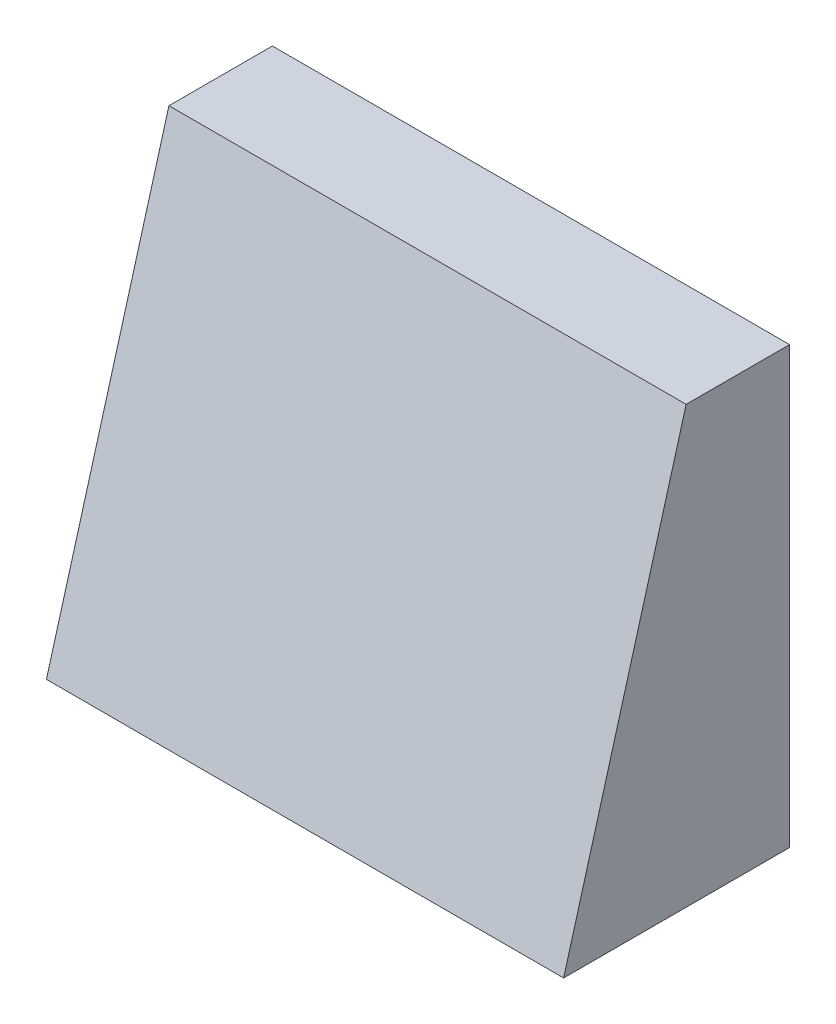
ISO-10303-21;
HEADER;
FILE_DESCRIPTION(('STEP AP214'),'2;1');
FILE_NAME('part.step','',(''),(''),'','','');
FILE_SCHEMA(('AUTOMOTIVE_DESIGN { 1 0 10303 214 1 1 1 1 }'));
ENDSEC;
DATA;
#1=APPLICATION_CONTEXT('core data for automotive mechanical design processes');
#2=APPLICATION_PROTOCOL_DEFINITION('international standard','automotive_design',2000,#1);
#3=PRODUCT_CONTEXT('',#1,'mechanical');
#4=PRODUCT('Part','Part','',(#3));
#5=PRODUCT_RELATED_PRODUCT_CATEGORY('part','',(#4));
#6=PRODUCT_DEFINITION_FORMATION('','',#4);
#7=PRODUCT_DEFINITION_CONTEXT('part definition',#1,'design');
#8=PRODUCT_DEFINITION('design','',#6,#7);
#9=PRODUCT_DEFINITION_SHAPE('','',#8);
#10=(LENGTH_UNIT() NAMED_UNIT(*) SI_UNIT(.MILLI.,.METRE.));
#11=(NAMED_UNIT(*) PLANE_ANGLE_UNIT() SI_UNIT($,.RADIAN.));
#12=(NAMED_UNIT(*) SI_UNIT($,.STERADIAN.) SOLID_ANGLE_UNIT());
#13=UNCERTAINTY_MEASURE_WITH_UNIT(LENGTH_MEASURE(1.E-05),#10,'distance_accuracy_value','');
#14=(GEOMETRIC_REPRESENTATION_CONTEXT(3) GLOBAL_UNCERTAINTY_ASSIGNED_CONTEXT((#13)) GLOBAL_UNIT_ASSIGNED_CONTEXT((#10,
#11,#12)) REPRESENTATION_CONTEXT('',''));
#15=CARTESIAN_POINT('',(0.,0.,0.));
#16=DIRECTION('',(0.,0.,1.));
#17=DIRECTION('',(1.,0.,0.));
#18=AXIS2_PLACEMENT_3D('',#15,#16,#17);
#19=CARTESIAN_POINT('',(-95.,40.,105.));
#20=DIRECTION('',(0.,-1.,0.));
#21=DIRECTION('',(0.,0.,-1.));
#22=AXIS2_PLACEMENT_3D('',#19,#20,#21);
#23=PLANE('',#22);
#24=DIRECTION('',(0.,0.,1.));
#25=VECTOR('',#24,1.);
#26=CARTESIAN_POINT('',(88.,40.,105.));
#27=LINE('',#26,#25);
#28=CARTESIAN_POINT('',(88.,40.,22.));
#29=VERTEX_POINT('',#28);
#30=CARTESIAN_POINT('',(88.,40.,100.41935483871));
#31=VERTEX_POINT('',#30);
#32=EDGE_CURVE('E169',#29,#31,#27,.T.);
#33=ORIENTED_EDGE('',*,*,#32,.F.);
#34=DIRECTION('',(1.,0.,0.));
#35=VECTOR('',#34,1.);
#36=CARTESIAN_POINT('',(-95.,40.,22.));
#37=LINE('',#36,#35);
#38=CARTESIAN_POINT('',(95.,40.,22.));
#39=VERTEX_POINT('',#38);
#40=EDGE_CURVE('E195',#29,#39,#37,.T.);
#41=ORIENTED_EDGE('',*,*,#40,.T.);
#42=DIRECTION('',(0.,0.,-1.));
#43=VECTOR('',#42,1.);
#44=CARTESIAN_POINT('',(95.,40.,105.));
#45=LINE('',#44,#43);
#46=CARTESIAN_POINT('',(95.,40.,105.));
#47=VERTEX_POINT('',#46);
#48=EDGE_CURVE('E168',#47,#39,#45,.T.);
#49=ORIENTED_EDGE('',*,*,#48,.F.);
#50=DIRECTION('',(1.,0.,0.));
#51=VECTOR('',#50,1.);
#52=CARTESIAN_POINT('',(-95.,40.,105.));
#53=LINE('',#52,#51);
#54=CARTESIAN_POINT('',(-95.,40.,105.));
#55=VERTEX_POINT('',#54);
#56=EDGE_CURVE('E194',#55,#47,#53,.T.);
#57=ORIENTED_EDGE('',*,*,#56,.F.);
#58=DIRECTION('',(0.,0.,-1.));
#59=VECTOR('',#58,1.);
#60=CARTESIAN_POINT('',(-95.,40.,105.));
#61=LINE('',#60,#59);
#62=CARTESIAN_POINT('',(-95.,40.,22.));
#63=VERTEX_POINT('',#62);
#64=EDGE_CURVE('E182',#55,#63,#61,.T.);
#65=ORIENTED_EDGE('',*,*,#64,.T.);
#66=CARTESIAN_POINT('',(-88.,40.,22.));
#67=VERTEX_POINT('',#66);
#68=EDGE_CURVE('E203',#63,#67,#37,.T.);
#69=ORIENTED_EDGE('',*,*,#68,.T.);
#70=DIRECTION('',(0.,0.,1.));
#71=VECTOR('',#70,1.);
#72=CARTESIAN_POINT('',(-88.,40.,105.));
#73=LINE('',#72,#71);
#74=CARTESIAN_POINT('',(-88.,40.,100.41935483871));
#75=VERTEX_POINT('',#74);
#76=EDGE_CURVE('E164',#67,#75,#73,.T.);
#77=ORIENTED_EDGE('',*,*,#76,.T.);
#78=DIRECTION('',(1.,0.,0.));
#79=VECTOR('',#78,1.);
#80=CARTESIAN_POINT('',(-95.,40.,100.41935483871));
#81=LINE('',#80,#79);
#82=EDGE_CURVE('E134',#75,#31,#81,.T.);
#83=ORIENTED_EDGE('',*,*,#82,.T.);
#84=EDGE_LOOP('',(#33,#41,#49,#57,#65,#69,#77,#83));
#85=FACE_BOUND('',#84,.T.);
#86=ADVANCED_FACE('F39',(#85),#23,.T.);
#87=CARTESIAN_POINT('',(-95.,200.,60.));
#88=DIRECTION('',(0.,0.270745576918284,0.962650940153899));
#89=DIRECTION('',(0.,-0.962650940153899,0.270745576918284));
#90=AXIS2_PLACEMENT_3D('',#87,#88,#89);
#91=PLANE('',#90);
#92=ORIENTED_EDGE('',*,*,#56,.T.);
#93=DIRECTION('',(0.,-0.962650940153899,0.270745576918284));
#94=VECTOR('',#93,1.);
#95=CARTESIAN_POINT('',(95.,200.,60.));
#96=LINE('',#95,#94);
#97=CARTESIAN_POINT('',(95.,200.,60.));
#98=VERTEX_POINT('',#97);
#99=EDGE_CURVE('E179',#98,#47,#96,.T.);
#100=ORIENTED_EDGE('',*,*,#99,.F.);
#101=DIRECTION('',(1.,0.,0.));
#102=VECTOR('',#101,1.);
#103=CARTESIAN_POINT('',(-95.,200.,60.));
#104=LINE('',#103,#102);
#105=CARTESIAN_POINT('',(-95.,200.,60.));
#106=VERTEX_POINT('',#105);
#107=EDGE_CURVE('E198',#106,#98,#104,.T.);
#108=ORIENTED_EDGE('',*,*,#107,.F.);
#109=DIRECTION('',(0.,-0.962650940153899,0.270745576918284));
#110=VECTOR('',#109,1.);
#111=CARTESIAN_POINT('',(-95.,200.,60.));
#112=LINE('',#111,#110);
#113=EDGE_CURVE('E186',#106,#55,#112,.T.);
#114=ORIENTED_EDGE('',*,*,#113,.T.);
#115=EDGE_LOOP('',(#92,#100,#108,#114));
#116=FACE_BOUND('',#115,.T.);
#117=ADVANCED_FACE('F244',(#116),#91,.T.);
#118=CARTESIAN_POINT('',(-95.,200.,22.));
#119=DIRECTION('',(0.,1.,0.));
#120=DIRECTION('',(0.,0.,1.));
#121=AXIS2_PLACEMENT_3D('',#118,#119,#120);
#122=PLANE('',#121);
#123=ORIENTED_EDGE('',*,*,#107,.T.);
#124=DIRECTION('',(0.,0.,1.));
#125=VECTOR('',#124,1.);
#126=CARTESIAN_POINT('',(95.,200.,22.));
#127=LINE('',#126,#125);
#128=CARTESIAN_POINT('',(95.,200.,22.));
#129=VERTEX_POINT('',#128);
#130=EDGE_CURVE('E173',#129,#98,#127,.T.);
#131=ORIENTED_EDGE('',*,*,#130,.F.);
#132=DIRECTION('',(1.,0.,0.));
#133=VECTOR('',#132,1.);
#134=CARTESIAN_POINT('',(-95.,200.,22.));
#135=LINE('',#134,#133);
#136=CARTESIAN_POINT('',(-95.,200.,22.));
#137=VERTEX_POINT('',#136);
#138=EDGE_CURVE('E196',#137,#129,#135,.T.);
#139=ORIENTED_EDGE('',*,*,#138,.F.);
#140=DIRECTION('',(0.,0.,1.));
#141=VECTOR('',#140,1.);
#142=CARTESIAN_POINT('',(-95.,200.,22.));
#143=LINE('',#142,#141);
#144=EDGE_CURVE('E187',#137,#106,#143,.T.);
#145=ORIENTED_EDGE('',*,*,#144,.T.);
#146=EDGE_LOOP('',(#123,#131,#139,#145));
#147=FACE_BOUND('',#146,.T.);
#148=ADVANCED_FACE('F251',(#147),#122,.T.);
#149=CARTESIAN_POINT('',(-95.,40.,22.));
#150=DIRECTION('',(0.,0.,-1.));
#151=DIRECTION('',(-1.,0.,0.));
#152=AXIS2_PLACEMENT_3D('',#149,#150,#151);
#153=PLANE('',#152);
#154=DIRECTION('',(0.,-1.,0.));
#155=VECTOR('',#154,1.);
#156=CARTESIAN_POINT('',(88.,40.,22.));
#157=LINE('',#156,#155);
#158=CARTESIAN_POINT('',(88.,45.,22.));
#159=VERTEX_POINT('',#158);
#160=EDGE_CURVE('E207',#159,#29,#157,.T.);
#161=ORIENTED_EDGE('',*,*,#160,.F.);
#162=DIRECTION('',(1.,0.,0.));
#163=VECTOR('',#162,1.);
#164=CARTESIAN_POINT('',(-95.,45.,22.));
#165=LINE('',#164,#163);
#166=CARTESIAN_POINT('',(-88.,45.,22.));
#167=VERTEX_POINT('',#166);
#168=EDGE_CURVE('E141',#167,#159,#165,.T.);
#169=ORIENTED_EDGE('',*,*,#168,.F.);
#170=DIRECTION('',(0.,-1.,0.));
#171=VECTOR('',#170,1.);
#172=CARTESIAN_POINT('',(-88.,40.,22.));
#173=LINE('',#172,#171);
#174=EDGE_CURVE('E193',#167,#67,#173,.T.);
#175=ORIENTED_EDGE('',*,*,#174,.T.);
#176=ORIENTED_EDGE('',*,*,#68,.F.);
#177=DIRECTION('',(0.,1.,0.));
#178=VECTOR('',#177,1.);
#179=CARTESIAN_POINT('',(-95.,40.,22.));
#180=LINE('',#179,#178);
#181=EDGE_CURVE('E184',#63,#137,#180,.T.);
#182=ORIENTED_EDGE('',*,*,#181,.T.);
#183=ORIENTED_EDGE('',*,*,#138,.T.);
#184=DIRECTION('',(0.,1.,0.));
#185=VECTOR('',#184,1.);
#186=CARTESIAN_POINT('',(95.,40.,22.));
#187=LINE('',#186,#185);
#188=EDGE_CURVE('E174',#39,#129,#187,.T.);
#189=ORIENTED_EDGE('',*,*,#188,.F.);
#190=ORIENTED_EDGE('',*,*,#40,.F.);
#191=EDGE_LOOP('',(#161,#169,#175,#176,#182,#183,#189,#190));
#192=FACE_BOUND('',#191,.T.);
#193=CARTESIAN_POINT('',(-88.,193.,22.));
#194=VERTEX_POINT('',#193);
#195=CARTESIAN_POINT('',(-88.,52.,22.));
#196=VERTEX_POINT('',#195);
#197=EDGE_CURVE('E204',#194,#196,#173,.T.);
#198=ORIENTED_EDGE('',*,*,#197,.T.);
#199=DIRECTION('',(1.,0.,0.));
#200=VECTOR('',#199,1.);
#201=CARTESIAN_POINT('',(-95.,52.,22.));
#202=LINE('',#201,#200);
#203=CARTESIAN_POINT('',(88.,52.,22.));
#204=VERTEX_POINT('',#203);
#205=EDGE_CURVE('E135',#196,#204,#202,.T.);
#206=ORIENTED_EDGE('',*,*,#205,.T.);
#207=CARTESIAN_POINT('',(88.,193.,22.));
#208=VERTEX_POINT('',#207);
#209=EDGE_CURVE('E209',#208,#204,#157,.T.);
#210=ORIENTED_EDGE('',*,*,#209,.F.);
#211=DIRECTION('',(-1.,0.,0.));
#212=VECTOR('',#211,1.);
#213=CARTESIAN_POINT('',(-95.,193.,22.));
#214=LINE('',#213,#212);
#215=EDGE_CURVE('E206',#208,#194,#214,.T.);
#216=ORIENTED_EDGE('',*,*,#215,.T.);
#217=EDGE_LOOP('',(#198,#206,#210,#216));
#218=FACE_BOUND('',#217,.T.);
#219=ADVANCED_FACE('F234',(#192,#218),#153,.T.);
#220=CARTESIAN_POINT('',(-95.,0.,0.));
#221=DIRECTION('',(1.,0.,0.));
#222=DIRECTION('',(0.,0.,-1.));
#223=AXIS2_PLACEMENT_3D('',#220,#221,#222);
#224=PLANE('',#223);
#225=ORIENTED_EDGE('',*,*,#144,.F.);
#226=ORIENTED_EDGE('',*,*,#181,.F.);
#227=ORIENTED_EDGE('',*,*,#64,.F.);
#228=ORIENTED_EDGE('',*,*,#113,.F.);
#229=EDGE_LOOP('',(#225,#226,#227,#228));
#230=FACE_BOUND('',#229,.T.);
#231=ADVANCED_FACE('F250',(#230),#224,.F.);
#232=CARTESIAN_POINT('',(95.,0.,0.));
#233=DIRECTION('',(1.,0.,0.));
#234=DIRECTION('',(0.,0.,-1.));
#235=AXIS2_PLACEMENT_3D('',#232,#233,#234);
#236=PLANE('',#235);
#237=ORIENTED_EDGE('',*,*,#188,.T.);
#238=ORIENTED_EDGE('',*,*,#130,.T.);
#239=ORIENTED_EDGE('',*,*,#99,.T.);
#240=ORIENTED_EDGE('',*,*,#48,.T.);
#241=EDGE_LOOP('',(#237,#238,#239,#240));
#242=FACE_BOUND('',#241,.T.);
#243=ADVANCED_FACE('F239',(#242),#236,.T.);
#244=CARTESIAN_POINT('',(88.,193.,18.));
#245=DIRECTION('',(0.,-1.,0.));
#246=DIRECTION('',(0.,0.,-1.));
#247=AXIS2_PLACEMENT_3D('',#244,#245,#246);
#248=PLANE('',#247);
#249=DIRECTION('',(0.,0.,1.));
#250=VECTOR('',#249,1.);
#251=CARTESIAN_POINT('',(88.,193.,18.));
#252=LINE('',#251,#250);
#253=CARTESIAN_POINT('',(88.,193.,56.));
#254=VERTEX_POINT('',#253);
#255=EDGE_CURVE('E160',#208,#254,#252,.T.);
#256=ORIENTED_EDGE('',*,*,#255,.T.);
#257=DIRECTION('',(-1.,0.,0.));
#258=VECTOR('',#257,1.);
#259=CARTESIAN_POINT('',(88.,193.,56.));
#260=LINE('',#259,#258);
#261=CARTESIAN_POINT('',(-88.,193.,56.));
#262=VERTEX_POINT('',#261);
#263=EDGE_CURVE('E165',#254,#262,#260,.T.);
#264=ORIENTED_EDGE('',*,*,#263,.T.);
#265=DIRECTION('',(0.,0.,1.));
#266=VECTOR('',#265,1.);
#267=CARTESIAN_POINT('',(-88.,193.,18.));
#268=LINE('',#267,#266);
#269=EDGE_CURVE('E155',#194,#262,#268,.T.);
#270=ORIENTED_EDGE('',*,*,#269,.F.);
#271=ORIENTED_EDGE('',*,*,#215,.F.);
#272=EDGE_LOOP('',(#256,#264,#270,#271));
#273=FACE_BOUND('',#272,.T.);
#274=ADVANCED_FACE('F223',(#273),#248,.T.);
#275=CARTESIAN_POINT('',(88.,193.,56.));
#276=DIRECTION('',(0.,-0.278810194863955,-0.960346226753624));
#277=DIRECTION('',(0.,0.960346226753624,-0.278810194863955));
#278=AXIS2_PLACEMENT_3D('',#275,#276,#277);
#279=PLANE('',#278);
#280=DIRECTION('',(0.,-0.960346226753624,0.278810194863955));
#281=VECTOR('',#280,1.);
#282=CARTESIAN_POINT('',(-88.,193.,56.));
#283=LINE('',#282,#281);
#284=EDGE_CURVE('E152',#262,#75,#283,.T.);
#285=ORIENTED_EDGE('',*,*,#284,.F.);
#286=ORIENTED_EDGE('',*,*,#263,.F.);
#287=DIRECTION('',(0.,-0.960346226753624,0.278810194863955));
#288=VECTOR('',#287,1.);
#289=CARTESIAN_POINT('',(88.,193.,56.));
#290=LINE('',#289,#288);
#291=EDGE_CURVE('E157',#254,#31,#290,.T.);
#292=ORIENTED_EDGE('',*,*,#291,.T.);
#293=ORIENTED_EDGE('',*,*,#82,.F.);
#294=EDGE_LOOP('',(#285,#286,#292,#293));
#295=FACE_BOUND('',#294,.T.);
#296=ADVANCED_FACE('F219',(#295),#279,.T.);
#297=CARTESIAN_POINT('',(88.,0.,0.));
#298=DIRECTION('',(1.,0.,0.));
#299=DIRECTION('',(0.,0.,-1.));
#300=AXIS2_PLACEMENT_3D('',#297,#298,#299);
#301=PLANE('',#300);
#302=DIRECTION('',(0.,-1.,0.));
#303=VECTOR('',#302,1.);
#304=CARTESIAN_POINT('',(88.,0.,25.));
#305=LINE('',#304,#303);
#306=CARTESIAN_POINT('',(88.,52.,25.));
#307=VERTEX_POINT('',#306);
#308=CARTESIAN_POINT('',(88.,45.,25.));
#309=VERTEX_POINT('',#308);
#310=EDGE_CURVE('E140',#307,#309,#305,.T.);
#311=ORIENTED_EDGE('',*,*,#310,.T.);
#312=DIRECTION('',(0.,0.,-1.));
#313=VECTOR('',#312,1.);
#314=CARTESIAN_POINT('',(88.,45.,0.));
#315=LINE('',#314,#313);
#316=EDGE_CURVE('E149',#309,#159,#315,.T.);
#317=ORIENTED_EDGE('',*,*,#316,.T.);
#318=ORIENTED_EDGE('',*,*,#160,.T.);
#319=ORIENTED_EDGE('',*,*,#32,.T.);
#320=ORIENTED_EDGE('',*,*,#291,.F.);
#321=ORIENTED_EDGE('',*,*,#255,.F.);
#322=ORIENTED_EDGE('',*,*,#209,.T.);
#323=DIRECTION('',(0.,0.,1.));
#324=VECTOR('',#323,1.);
#325=CARTESIAN_POINT('',(88.,52.,0.));
#326=LINE('',#325,#324);
#327=EDGE_CURVE('E143',#204,#307,#326,.T.);
#328=ORIENTED_EDGE('',*,*,#327,.T.);
#329=EDGE_LOOP('',(#311,#317,#318,#319,#320,#321,#322,#328));
#330=FACE_BOUND('',#329,.T.);
#331=ADVANCED_FACE('F229',(#330),#301,.F.);
#332=CARTESIAN_POINT('',(-88.,0.,0.));
#333=DIRECTION('',(1.,0.,0.));
#334=DIRECTION('',(0.,0.,-1.));
#335=AXIS2_PLACEMENT_3D('',#332,#333,#334);
#336=PLANE('',#335);
#337=DIRECTION('',(0.,0.,-1.));
#338=VECTOR('',#337,1.);
#339=CARTESIAN_POINT('',(-88.,45.,0.));
#340=LINE('',#339,#338);
#341=CARTESIAN_POINT('',(-88.,45.,25.));
#342=VERTEX_POINT('',#341);
#343=EDGE_CURVE('E11',#342,#167,#340,.T.);
#344=ORIENTED_EDGE('',*,*,#343,.F.);
#345=DIRECTION('',(0.,-1.,0.));
#346=VECTOR('',#345,1.);
#347=CARTESIAN_POINT('',(-88.,0.,25.));
#348=LINE('',#347,#346);
#349=CARTESIAN_POINT('',(-88.,52.,25.));
#350=VERTEX_POINT('',#349);
#351=EDGE_CURVE('E46',#350,#342,#348,.T.);
#352=ORIENTED_EDGE('',*,*,#351,.F.);
#353=DIRECTION('',(0.,0.,1.));
#354=VECTOR('',#353,1.);
#355=CARTESIAN_POINT('',(-88.,52.,0.));
#356=LINE('',#355,#354);
#357=EDGE_CURVE('E121',#196,#350,#356,.T.);
#358=ORIENTED_EDGE('',*,*,#357,.F.);
#359=ORIENTED_EDGE('',*,*,#197,.F.);
#360=ORIENTED_EDGE('',*,*,#269,.T.);
#361=ORIENTED_EDGE('',*,*,#284,.T.);
#362=ORIENTED_EDGE('',*,*,#76,.F.);
#363=ORIENTED_EDGE('',*,*,#174,.F.);
#364=EDGE_LOOP('',(#344,#352,#358,#359,#360,#361,#362,#363));
#365=FACE_BOUND('',#364,.T.);
#366=ADVANCED_FACE('F124',(#365),#336,.T.);
#367=CARTESIAN_POINT('',(-95.,45.,25.));
#368=DIRECTION('',(0.,-1.,0.));
#369=DIRECTION('',(0.,0.,-1.));
#370=AXIS2_PLACEMENT_3D('',#367,#368,#369);
#371=PLANE('',#370);
#372=ORIENTED_EDGE('',*,*,#316,.F.);
#373=DIRECTION('',(1.,0.,0.));
#374=VECTOR('',#373,1.);
#375=CARTESIAN_POINT('',(-95.,45.,25.));
#376=LINE('',#375,#374);
#377=EDGE_CURVE('E136',#342,#309,#376,.T.);
#378=ORIENTED_EDGE('',*,*,#377,.F.);
#379=ORIENTED_EDGE('',*,*,#343,.T.);
#380=ORIENTED_EDGE('',*,*,#168,.T.);
#381=EDGE_LOOP('',(#372,#378,#379,#380));
#382=FACE_BOUND('',#381,.T.);
#383=ADVANCED_FACE('F253',(#382),#371,.T.);
#384=CARTESIAN_POINT('',(-95.,52.,25.));
#385=DIRECTION('',(0.,0.,1.));
#386=DIRECTION('',(1.,0.,0.));
#387=AXIS2_PLACEMENT_3D('',#384,#385,#386);
#388=PLANE('',#387);
#389=ORIENTED_EDGE('',*,*,#310,.F.);
#390=DIRECTION('',(1.,0.,0.));
#391=VECTOR('',#390,1.);
#392=CARTESIAN_POINT('',(-95.,52.,25.));
#393=LINE('',#392,#391);
#394=EDGE_CURVE('E52',#350,#307,#393,.T.);
#395=ORIENTED_EDGE('',*,*,#394,.F.);
#396=ORIENTED_EDGE('',*,*,#351,.T.);
#397=ORIENTED_EDGE('',*,*,#377,.T.);
#398=EDGE_LOOP('',(#389,#395,#396,#397));
#399=FACE_BOUND('',#398,.T.);
#400=ADVANCED_FACE('F133',(#399),#388,.T.);
#401=CARTESIAN_POINT('',(-95.,52.,22.));
#402=DIRECTION('',(0.,1.,0.));
#403=DIRECTION('',(0.,0.,1.));
#404=AXIS2_PLACEMENT_3D('',#401,#402,#403);
#405=PLANE('',#404);
#406=ORIENTED_EDGE('',*,*,#327,.F.);
#407=ORIENTED_EDGE('',*,*,#205,.F.);
#408=ORIENTED_EDGE('',*,*,#357,.T.);
#409=ORIENTED_EDGE('',*,*,#394,.T.);
#410=EDGE_LOOP('',(#406,#407,#408,#409));
#411=FACE_BOUND('',#410,.T.);
#412=ADVANCED_FACE('F128',(#411),#405,.T.);
#413=CLOSED_SHELL('',(#86,#117,#148,#219,#231,#243,#274,#296,#331,#366,#383,#400,#412));
#414=MANIFOLD_SOLID_BREP('B2',#413);
#415=ADVANCED_BREP_SHAPE_REPRESENTATION('',(#18,#414),#14);
#416=SHAPE_DEFINITION_REPRESENTATION(#9,#415);
ENDSEC;
END-ISO-10303-21;
